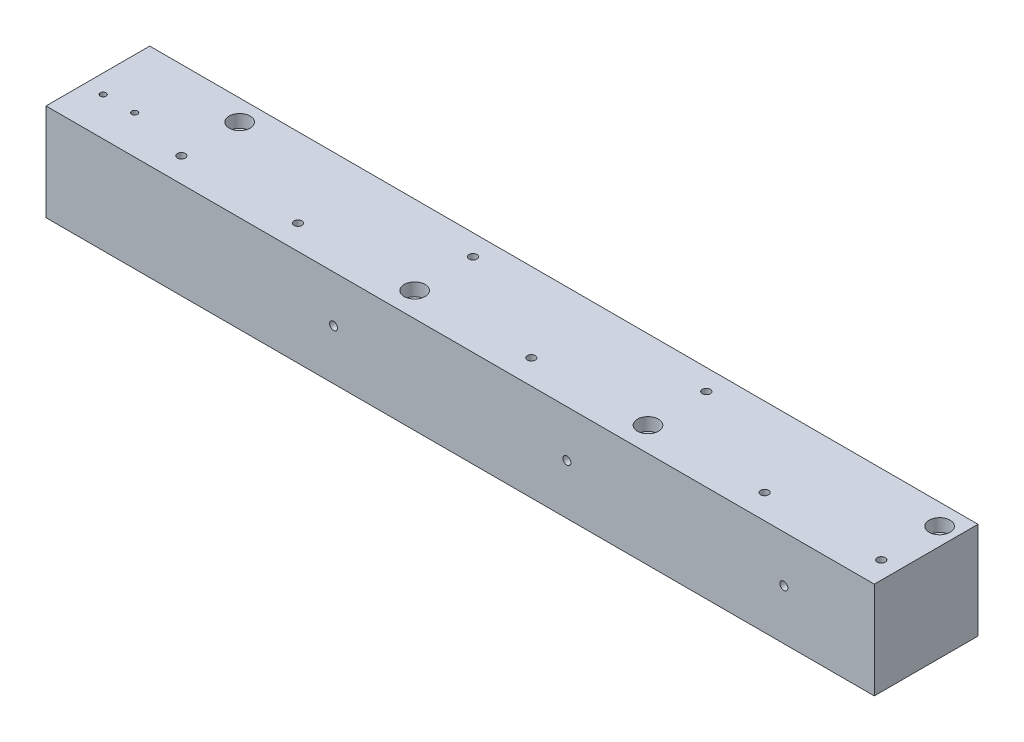
ISO-10303-21;
HEADER;
FILE_DESCRIPTION(('STEP AP214'),'2;1');
FILE_NAME('part.step','',(''),(''),'','','');
FILE_SCHEMA(('AUTOMOTIVE_DESIGN { 1 0 10303 214 1 1 1 1 }'));
ENDSEC;
DATA;
#1=APPLICATION_CONTEXT('core data for automotive mechanical design processes');
#2=APPLICATION_PROTOCOL_DEFINITION('international standard','automotive_design',2000,#1);
#3=PRODUCT_CONTEXT('',#1,'mechanical');
#4=PRODUCT('Part','Part','',(#3));
#5=PRODUCT_RELATED_PRODUCT_CATEGORY('part','',(#4));
#6=PRODUCT_DEFINITION_FORMATION('','',#4);
#7=PRODUCT_DEFINITION_CONTEXT('part definition',#1,'design');
#8=PRODUCT_DEFINITION('design','',#6,#7);
#9=PRODUCT_DEFINITION_SHAPE('','',#8);
#10=(LENGTH_UNIT() NAMED_UNIT(*) SI_UNIT(.MILLI.,.METRE.));
#11=(NAMED_UNIT(*) PLANE_ANGLE_UNIT() SI_UNIT($,.RADIAN.));
#12=(NAMED_UNIT(*) SI_UNIT($,.STERADIAN.) SOLID_ANGLE_UNIT());
#13=UNCERTAINTY_MEASURE_WITH_UNIT(LENGTH_MEASURE(1.E-05),#10,'distance_accuracy_value','');
#14=(GEOMETRIC_REPRESENTATION_CONTEXT(3) GLOBAL_UNCERTAINTY_ASSIGNED_CONTEXT((#13)) GLOBAL_UNIT_ASSIGNED_CONTEXT((#10,
#11,#12)) REPRESENTATION_CONTEXT('',''));
#15=CARTESIAN_POINT('',(0.,0.,0.));
#16=DIRECTION('',(0.,0.,1.));
#17=DIRECTION('',(1.,0.,0.));
#18=AXIS2_PLACEMENT_3D('',#15,#16,#17);
#19=CARTESIAN_POINT('',(0.,0.,88.9));
#20=DIRECTION('',(1.,0.,0.));
#21=DIRECTION('',(0.,0.,-1.));
#22=AXIS2_PLACEMENT_3D('',#19,#20,#21);
#23=PLANE('',#22);
#24=DIRECTION('',(0.,-1.,0.));
#25=VECTOR('',#24,1.);
#26=CARTESIAN_POINT('',(0.,0.,0.));
#27=LINE('',#26,#25);
#28=CARTESIAN_POINT('',(0.,83.,0.));
#29=VERTEX_POINT('',#28);
#30=CARTESIAN_POINT('',(0.,0.,0.));
#31=VERTEX_POINT('',#30);
#32=EDGE_CURVE('E253',#29,#31,#27,.T.);
#33=ORIENTED_EDGE('',*,*,#32,.T.);
#34=DIRECTION('',(0.,0.,-1.));
#35=VECTOR('',#34,1.);
#36=CARTESIAN_POINT('',(0.,0.,88.9));
#37=LINE('',#36,#35);
#38=CARTESIAN_POINT('',(0.,0.,88.9));
#39=VERTEX_POINT('',#38);
#40=EDGE_CURVE('E11',#39,#31,#37,.T.);
#41=ORIENTED_EDGE('',*,*,#40,.F.);
#42=DIRECTION('',(0.,-1.,0.));
#43=VECTOR('',#42,1.);
#44=CARTESIAN_POINT('',(0.,0.,88.9));
#45=LINE('',#44,#43);
#46=CARTESIAN_POINT('',(0.,83.,88.9));
#47=VERTEX_POINT('',#46);
#48=EDGE_CURVE('E254',#47,#39,#45,.T.);
#49=ORIENTED_EDGE('',*,*,#48,.F.);
#50=DIRECTION('',(0.,0.,-1.));
#51=VECTOR('',#50,1.);
#52=CARTESIAN_POINT('',(0.,83.,88.9));
#53=LINE('',#52,#51);
#54=EDGE_CURVE('E260',#47,#29,#53,.T.);
#55=ORIENTED_EDGE('',*,*,#54,.T.);
#56=EDGE_LOOP('',(#33,#41,#49,#55));
#57=FACE_BOUND('',#56,.T.);
#58=ADVANCED_FACE('F40',(#57),#23,.F.);
#59=CARTESIAN_POINT('',(0.,0.,88.9));
#60=DIRECTION('',(0.,1.,0.));
#61=DIRECTION('',(0.,0.,1.));
#62=AXIS2_PLACEMENT_3D('',#59,#60,#61);
#63=PLANE('',#62);
#64=CARTESIAN_POINT('',(695.,0.,17.9));
#65=DIRECTION('',(0.,1.,0.));
#66=DIRECTION('',(0.,0.,1.));
#67=AXIS2_PLACEMENT_3D('',#64,#65,#66);
#68=CIRCLE('',#67,5.49999999999995);
#69=CARTESIAN_POINT('',(695.,0.,23.3999999999999));
#70=VERTEX_POINT('',#69);
#71=EDGE_CURVE('E172',#70,#70,#68,.T.);
#72=ORIENTED_EDGE('',*,*,#71,.T.);
#73=EDGE_LOOP('',(#72));
#74=FACE_BOUND('',#73,.T.);
#75=CARTESIAN_POINT('',(495.,0.,67.9));
#76=DIRECTION('',(0.,1.,0.));
#77=DIRECTION('',(0.,0.,1.));
#78=AXIS2_PLACEMENT_3D('',#75,#76,#77);
#79=CIRCLE('',#78,5.49999999999995);
#80=CARTESIAN_POINT('',(495.,0.,73.3999999999999));
#81=VERTEX_POINT('',#80);
#82=EDGE_CURVE('E184',#81,#81,#79,.T.);
#83=ORIENTED_EDGE('',*,*,#82,.T.);
#84=EDGE_LOOP('',(#83));
#85=FACE_BOUND('',#84,.T.);
#86=CARTESIAN_POINT('',(295.,0.,67.9));
#87=DIRECTION('',(0.,1.,0.));
#88=DIRECTION('',(0.,0.,1.));
#89=AXIS2_PLACEMENT_3D('',#86,#87,#88);
#90=CIRCLE('',#89,5.50000000000001);
#91=CARTESIAN_POINT('',(295.,0.,73.4));
#92=VERTEX_POINT('',#91);
#93=EDGE_CURVE('E196',#92,#92,#90,.T.);
#94=ORIENTED_EDGE('',*,*,#93,.T.);
#95=EDGE_LOOP('',(#94));
#96=FACE_BOUND('',#95,.T.);
#97=CARTESIAN_POINT('',(95.,0.,17.9));
#98=DIRECTION('',(0.,1.,0.));
#99=DIRECTION('',(0.,0.,1.));
#100=AXIS2_PLACEMENT_3D('',#97,#98,#99);
#101=CIRCLE('',#100,5.49999999999998);
#102=CARTESIAN_POINT('',(95.,0.,23.3999999999999));
#103=VERTEX_POINT('',#102);
#104=EDGE_CURVE('E208',#103,#103,#101,.T.);
#105=ORIENTED_EDGE('',*,*,#104,.T.);
#106=EDGE_LOOP('',(#105));
#107=FACE_BOUND('',#106,.T.);
#108=DIRECTION('',(1.,0.,0.));
#109=VECTOR('',#108,1.);
#110=CARTESIAN_POINT('',(0.,0.,0.));
#111=LINE('',#110,#109);
#112=CARTESIAN_POINT('',(710.,0.,0.));
#113=VERTEX_POINT('',#112);
#114=EDGE_CURVE('E263',#31,#113,#111,.T.);
#115=ORIENTED_EDGE('',*,*,#114,.T.);
#116=DIRECTION('',(0.,0.,-1.));
#117=VECTOR('',#116,1.);
#118=CARTESIAN_POINT('',(710.,0.,88.9));
#119=LINE('',#118,#117);
#120=CARTESIAN_POINT('',(710.,0.,88.9));
#121=VERTEX_POINT('',#120);
#122=EDGE_CURVE('E48',#121,#113,#119,.T.);
#123=ORIENTED_EDGE('',*,*,#122,.F.);
#124=DIRECTION('',(1.,0.,0.));
#125=VECTOR('',#124,1.);
#126=CARTESIAN_POINT('',(0.,0.,88.9));
#127=LINE('',#126,#125);
#128=EDGE_CURVE('E87',#39,#121,#127,.T.);
#129=ORIENTED_EDGE('',*,*,#128,.F.);
#130=ORIENTED_EDGE('',*,*,#40,.T.);
#131=EDGE_LOOP('',(#115,#123,#129,#130));
#132=FACE_BOUND('',#131,.T.);
#133=ADVANCED_FACE('F288',(#74,#85,#96,#107,#132),#63,.F.);
#134=CARTESIAN_POINT('',(710.,0.,88.9));
#135=DIRECTION('',(-1.,0.,0.));
#136=DIRECTION('',(0.,0.,1.));
#137=AXIS2_PLACEMENT_3D('',#134,#135,#136);
#138=PLANE('',#137);
#139=DIRECTION('',(0.,1.,0.));
#140=VECTOR('',#139,1.);
#141=CARTESIAN_POINT('',(710.,0.,0.));
#142=LINE('',#141,#140);
#143=CARTESIAN_POINT('',(710.,83.,0.));
#144=VERTEX_POINT('',#143);
#145=EDGE_CURVE('E74',#113,#144,#142,.T.);
#146=ORIENTED_EDGE('',*,*,#145,.T.);
#147=DIRECTION('',(0.,0.,-1.));
#148=VECTOR('',#147,1.);
#149=CARTESIAN_POINT('',(710.,83.,88.9));
#150=LINE('',#149,#148);
#151=CARTESIAN_POINT('',(710.,83.,88.9));
#152=VERTEX_POINT('',#151);
#153=EDGE_CURVE('E268',#152,#144,#150,.T.);
#154=ORIENTED_EDGE('',*,*,#153,.F.);
#155=DIRECTION('',(0.,1.,0.));
#156=VECTOR('',#155,1.);
#157=CARTESIAN_POINT('',(710.,0.,88.9));
#158=LINE('',#157,#156);
#159=EDGE_CURVE('E257',#121,#152,#158,.T.);
#160=ORIENTED_EDGE('',*,*,#159,.F.);
#161=ORIENTED_EDGE('',*,*,#122,.T.);
#162=EDGE_LOOP('',(#146,#154,#160,#161));
#163=FACE_BOUND('',#162,.T.);
#164=ADVANCED_FACE('F270',(#163),#138,.F.);
#165=CARTESIAN_POINT('',(0.,83.,88.9));
#166=DIRECTION('',(0.,-1.,0.));
#167=DIRECTION('',(0.,0.,-1.));
#168=AXIS2_PLACEMENT_3D('',#165,#166,#167);
#169=PLANE('',#168);
#170=CARTESIAN_POINT('',(16.,83.,55.9));
#171=DIRECTION('',(0.,1.,0.));
#172=DIRECTION('',(0.,0.,1.));
#173=AXIS2_PLACEMENT_3D('',#170,#171,#172);
#174=CIRCLE('',#173,2.5);
#175=CARTESIAN_POINT('',(16.,83.,58.4));
#176=VERTEX_POINT('',#175);
#177=EDGE_CURVE('E151',#176,#176,#174,.T.);
#178=ORIENTED_EDGE('',*,*,#177,.F.);
#179=EDGE_LOOP('',(#178));
#180=FACE_BOUND('',#179,.T.);
#181=CARTESIAN_POINT('',(43.,83.,55.9));
#182=DIRECTION('',(0.,1.,0.));
#183=DIRECTION('',(0.,0.,1.));
#184=AXIS2_PLACEMENT_3D('',#181,#182,#183);
#185=CIRCLE('',#184,2.5);
#186=CARTESIAN_POINT('',(43.,83.,58.4));
#187=VERTEX_POINT('',#186);
#188=EDGE_CURVE('E157',#187,#187,#185,.T.);
#189=ORIENTED_EDGE('',*,*,#188,.F.);
#190=EDGE_LOOP('',(#189));
#191=FACE_BOUND('',#190,.T.);
#192=CARTESIAN_POINT('',(695.,83.,17.9));
#193=DIRECTION('',(0.,1.,0.));
#194=DIRECTION('',(0.,0.,1.));
#195=AXIS2_PLACEMENT_3D('',#192,#193,#194);
#196=CIRCLE('',#195,9.00000000000001);
#197=CARTESIAN_POINT('',(695.,83.,26.9));
#198=VERTEX_POINT('',#197);
#199=EDGE_CURVE('E163',#198,#198,#196,.T.);
#200=ORIENTED_EDGE('',*,*,#199,.F.);
#201=EDGE_LOOP('',(#200));
#202=FACE_BOUND('',#201,.T.);
#203=CARTESIAN_POINT('',(495.,83.,67.9));
#204=DIRECTION('',(0.,1.,0.));
#205=DIRECTION('',(0.,0.,1.));
#206=AXIS2_PLACEMENT_3D('',#203,#204,#205);
#207=CIRCLE('',#206,9.00000000000001);
#208=CARTESIAN_POINT('',(495.,83.,76.9));
#209=VERTEX_POINT('',#208);
#210=EDGE_CURVE('E175',#209,#209,#207,.T.);
#211=ORIENTED_EDGE('',*,*,#210,.F.);
#212=EDGE_LOOP('',(#211));
#213=FACE_BOUND('',#212,.T.);
#214=CARTESIAN_POINT('',(295.,83.,67.9));
#215=DIRECTION('',(0.,1.,0.));
#216=DIRECTION('',(0.,0.,1.));
#217=AXIS2_PLACEMENT_3D('',#214,#215,#216);
#218=CIRCLE('',#217,9.00000000000001);
#219=CARTESIAN_POINT('',(295.,83.,76.9));
#220=VERTEX_POINT('',#219);
#221=EDGE_CURVE('E187',#220,#220,#218,.T.);
#222=ORIENTED_EDGE('',*,*,#221,.F.);
#223=EDGE_LOOP('',(#222));
#224=FACE_BOUND('',#223,.T.);
#225=CARTESIAN_POINT('',(95.,83.,17.9));
#226=DIRECTION('',(0.,1.,0.));
#227=DIRECTION('',(0.,0.,1.));
#228=AXIS2_PLACEMENT_3D('',#225,#226,#227);
#229=CIRCLE('',#228,9.00000000000001);
#230=CARTESIAN_POINT('',(95.,83.,26.9));
#231=VERTEX_POINT('',#230);
#232=EDGE_CURVE('E199',#231,#231,#229,.T.);
#233=ORIENTED_EDGE('',*,*,#232,.F.);
#234=EDGE_LOOP('',(#233));
#235=FACE_BOUND('',#234,.T.);
#236=CARTESIAN_POINT('',(95.,83.,67.9));
#237=DIRECTION('',(0.,1.,0.));
#238=DIRECTION('',(0.,0.,1.));
#239=AXIS2_PLACEMENT_3D('',#236,#237,#238);
#240=CIRCLE('',#239,3.4);
#241=CARTESIAN_POINT('',(95.,83.,71.3));
#242=VERTEX_POINT('',#241);
#243=EDGE_CURVE('E211',#242,#242,#240,.T.);
#244=ORIENTED_EDGE('',*,*,#243,.F.);
#245=EDGE_LOOP('',(#244));
#246=FACE_BOUND('',#245,.T.);
#247=CARTESIAN_POINT('',(195.,83.,67.9));
#248=DIRECTION('',(0.,1.,0.));
#249=DIRECTION('',(0.,0.,1.));
#250=AXIS2_PLACEMENT_3D('',#247,#248,#249);
#251=CIRCLE('',#250,3.39999999999999);
#252=CARTESIAN_POINT('',(195.,83.,71.3));
#253=VERTEX_POINT('',#252);
#254=EDGE_CURVE('E217',#253,#253,#251,.T.);
#255=ORIENTED_EDGE('',*,*,#254,.F.);
#256=EDGE_LOOP('',(#255));
#257=FACE_BOUND('',#256,.T.);
#258=CARTESIAN_POINT('',(295.,83.,17.9));
#259=DIRECTION('',(0.,1.,0.));
#260=DIRECTION('',(0.,0.,1.));
#261=AXIS2_PLACEMENT_3D('',#258,#259,#260);
#262=CIRCLE('',#261,3.40000000000001);
#263=CARTESIAN_POINT('',(295.,83.,21.3));
#264=VERTEX_POINT('',#263);
#265=EDGE_CURVE('E223',#264,#264,#262,.T.);
#266=ORIENTED_EDGE('',*,*,#265,.F.);
#267=EDGE_LOOP('',(#266));
#268=FACE_BOUND('',#267,.T.);
#269=CARTESIAN_POINT('',(395.,83.,67.9));
#270=DIRECTION('',(0.,1.,0.));
#271=DIRECTION('',(0.,0.,1.));
#272=AXIS2_PLACEMENT_3D('',#269,#270,#271);
#273=CIRCLE('',#272,3.40000000000001);
#274=CARTESIAN_POINT('',(395.,83.,71.3));
#275=VERTEX_POINT('',#274);
#276=EDGE_CURVE('E229',#275,#275,#273,.T.);
#277=ORIENTED_EDGE('',*,*,#276,.F.);
#278=EDGE_LOOP('',(#277));
#279=FACE_BOUND('',#278,.T.);
#280=CARTESIAN_POINT('',(495.,83.,17.9));
#281=DIRECTION('',(0.,1.,0.));
#282=DIRECTION('',(0.,0.,1.));
#283=AXIS2_PLACEMENT_3D('',#280,#281,#282);
#284=CIRCLE('',#283,3.40000000000001);
#285=CARTESIAN_POINT('',(495.,83.,21.3));
#286=VERTEX_POINT('',#285);
#287=EDGE_CURVE('E235',#286,#286,#284,.T.);
#288=ORIENTED_EDGE('',*,*,#287,.F.);
#289=EDGE_LOOP('',(#288));
#290=FACE_BOUND('',#289,.T.);
#291=CARTESIAN_POINT('',(595.,83.,67.8999999999999));
#292=DIRECTION('',(0.,1.,0.));
#293=DIRECTION('',(0.,0.,1.));
#294=AXIS2_PLACEMENT_3D('',#291,#292,#293);
#295=CIRCLE('',#294,3.39999999999996);
#296=CARTESIAN_POINT('',(595.,83.,71.2999999999999));
#297=VERTEX_POINT('',#296);
#298=EDGE_CURVE('E241',#297,#297,#295,.T.);
#299=ORIENTED_EDGE('',*,*,#298,.F.);
#300=EDGE_LOOP('',(#299));
#301=FACE_BOUND('',#300,.T.);
#302=CARTESIAN_POINT('',(695.,83.,67.9));
#303=DIRECTION('',(0.,1.,0.));
#304=DIRECTION('',(0.,0.,1.));
#305=AXIS2_PLACEMENT_3D('',#302,#303,#304);
#306=CIRCLE('',#305,3.39999999999996);
#307=CARTESIAN_POINT('',(695.,83.,71.2999999999999));
#308=VERTEX_POINT('',#307);
#309=EDGE_CURVE('E247',#308,#308,#306,.T.);
#310=ORIENTED_EDGE('',*,*,#309,.F.);
#311=EDGE_LOOP('',(#310));
#312=FACE_BOUND('',#311,.T.);
#313=DIRECTION('',(-1.,0.,0.));
#314=VECTOR('',#313,1.);
#315=CARTESIAN_POINT('',(0.,83.,0.));
#316=LINE('',#315,#314);
#317=EDGE_CURVE('E80',#144,#29,#316,.T.);
#318=ORIENTED_EDGE('',*,*,#317,.T.);
#319=ORIENTED_EDGE('',*,*,#54,.F.);
#320=DIRECTION('',(-1.,0.,0.));
#321=VECTOR('',#320,1.);
#322=CARTESIAN_POINT('',(0.,83.,88.9));
#323=LINE('',#322,#321);
#324=EDGE_CURVE('E56',#152,#47,#323,.T.);
#325=ORIENTED_EDGE('',*,*,#324,.F.);
#326=ORIENTED_EDGE('',*,*,#153,.T.);
#327=EDGE_LOOP('',(#318,#319,#325,#326));
#328=FACE_BOUND('',#327,.T.);
#329=ADVANCED_FACE('F277',(#180,#191,#202,#213,#224,#235,#246,#257,#268,#279,#290,#301,#312,
#328),#169,.F.);
#330=CARTESIAN_POINT('',(0.,0.,88.9));
#331=DIRECTION('',(0.,0.,-1.));
#332=DIRECTION('',(-1.,0.,0.));
#333=AXIS2_PLACEMENT_3D('',#330,#331,#332);
#334=PLANE('',#333);
#335=CARTESIAN_POINT('',(246.5,43.,88.9));
#336=DIRECTION('',(0.,0.,1.));
#337=DIRECTION('',(1.,0.,0.));
#338=AXIS2_PLACEMENT_3D('',#335,#336,#337);
#339=CIRCLE('',#338,3.39999999999999);
#340=CARTESIAN_POINT('',(249.9,43.,88.9));
#341=VERTEX_POINT('',#340);
#342=EDGE_CURVE('E135',#341,#341,#339,.T.);
#343=ORIENTED_EDGE('',*,*,#342,.F.);
#344=EDGE_LOOP('',(#343));
#345=FACE_BOUND('',#344,.T.);
#346=CARTESIAN_POINT('',(446.5,43.,88.9));
#347=DIRECTION('',(0.,0.,1.));
#348=DIRECTION('',(1.,0.,0.));
#349=AXIS2_PLACEMENT_3D('',#346,#347,#348);
#350=CIRCLE('',#349,3.40000000000001);
#351=CARTESIAN_POINT('',(449.9,43.,88.9));
#352=VERTEX_POINT('',#351);
#353=EDGE_CURVE('E134',#352,#352,#350,.T.);
#354=ORIENTED_EDGE('',*,*,#353,.F.);
#355=EDGE_LOOP('',(#354));
#356=FACE_BOUND('',#355,.T.);
#357=CARTESIAN_POINT('',(632.5,43.,88.9));
#358=DIRECTION('',(0.,0.,1.));
#359=DIRECTION('',(1.,0.,0.));
#360=AXIS2_PLACEMENT_3D('',#357,#358,#359);
#361=CIRCLE('',#360,3.39999999999996);
#362=CARTESIAN_POINT('',(635.9,43.,88.9));
#363=VERTEX_POINT('',#362);
#364=EDGE_CURVE('E145',#363,#363,#361,.T.);
#365=ORIENTED_EDGE('',*,*,#364,.F.);
#366=EDGE_LOOP('',(#365));
#367=FACE_BOUND('',#366,.T.);
#368=ORIENTED_EDGE('',*,*,#48,.T.);
#369=ORIENTED_EDGE('',*,*,#128,.T.);
#370=ORIENTED_EDGE('',*,*,#159,.T.);
#371=ORIENTED_EDGE('',*,*,#324,.T.);
#372=EDGE_LOOP('',(#368,#369,#370,#371));
#373=FACE_BOUND('',#372,.T.);
#374=ADVANCED_FACE('F279',(#345,#356,#367,#373),#334,.F.);
#375=CARTESIAN_POINT('',(0.,0.,0.));
#376=DIRECTION('',(0.,0.,-1.));
#377=DIRECTION('',(-1.,0.,0.));
#378=AXIS2_PLACEMENT_3D('',#375,#376,#377);
#379=PLANE('',#378);
#380=ORIENTED_EDGE('',*,*,#32,.F.);
#381=ORIENTED_EDGE('',*,*,#317,.F.);
#382=ORIENTED_EDGE('',*,*,#145,.F.);
#383=ORIENTED_EDGE('',*,*,#114,.F.);
#384=EDGE_LOOP('',(#380,#381,#382,#383));
#385=FACE_BOUND('',#384,.T.);
#386=ADVANCED_FACE('F273',(#385),#379,.T.);
#387=CARTESIAN_POINT('',(695.,50.01,67.9));
#388=DIRECTION('',(0.,1.,0.));
#389=DIRECTION('',(0.,0.,1.));
#390=AXIS2_PLACEMENT_3D('',#387,#388,#389);
#391=CONICAL_SURFACE('',#390,3.39999999999996,1.02974425867665);
#392=CARTESIAN_POINT('',(695.,47.9670738953063,67.9));
#393=VERTEX_POINT('',#392);
#394=VERTEX_LOOP('',#393);
#395=FACE_BOUND('',#394,.T.);
#396=CARTESIAN_POINT('',(695.,50.01,67.9));
#397=DIRECTION('',(0.,1.,0.));
#398=DIRECTION('',(0.,0.,1.));
#399=AXIS2_PLACEMENT_3D('',#396,#397,#398);
#400=CIRCLE('',#399,3.39999999999996);
#401=CARTESIAN_POINT('',(695.,50.01,71.2999999999999));
#402=VERTEX_POINT('',#401);
#403=EDGE_CURVE('E250',#402,#402,#400,.T.);
#404=ORIENTED_EDGE('',*,*,#403,.T.);
#405=EDGE_LOOP('',(#404));
#406=FACE_BOUND('',#405,.T.);
#407=ADVANCED_FACE('F346',(#395,#406),#391,.F.);
#408=CARTESIAN_POINT('',(695.,83.,67.9));
#409=DIRECTION('',(0.,1.,0.));
#410=DIRECTION('',(0.,0.,1.));
#411=AXIS2_PLACEMENT_3D('',#408,#409,#410);
#412=CYLINDRICAL_SURFACE('',#411,3.39999999999996);
#413=ORIENTED_EDGE('',*,*,#403,.F.);
#414=EDGE_LOOP('',(#413));
#415=FACE_BOUND('',#414,.T.);
#416=ORIENTED_EDGE('',*,*,#309,.T.);
#417=EDGE_LOOP('',(#416));
#418=FACE_BOUND('',#417,.T.);
#419=ADVANCED_FACE('F343',(#415,#418),#412,.F.);
#420=CARTESIAN_POINT('',(595.,50.01,67.8999999999999));
#421=DIRECTION('',(0.,1.,0.));
#422=DIRECTION('',(0.,0.,1.));
#423=AXIS2_PLACEMENT_3D('',#420,#421,#422);
#424=CONICAL_SURFACE('',#423,3.39999999999996,1.02974425867665);
#425=CARTESIAN_POINT('',(595.,47.9670738953063,67.8999999999999));
#426=VERTEX_POINT('',#425);
#427=VERTEX_LOOP('',#426);
#428=FACE_BOUND('',#427,.T.);
#429=CARTESIAN_POINT('',(595.,50.01,67.8999999999999));
#430=DIRECTION('',(0.,1.,0.));
#431=DIRECTION('',(0.,0.,1.));
#432=AXIS2_PLACEMENT_3D('',#429,#430,#431);
#433=CIRCLE('',#432,3.39999999999996);
#434=CARTESIAN_POINT('',(595.,50.01,71.2999999999999));
#435=VERTEX_POINT('',#434);
#436=EDGE_CURVE('E244',#435,#435,#433,.T.);
#437=ORIENTED_EDGE('',*,*,#436,.T.);
#438=EDGE_LOOP('',(#437));
#439=FACE_BOUND('',#438,.T.);
#440=ADVANCED_FACE('F345',(#428,#439),#424,.F.);
#441=CARTESIAN_POINT('',(595.,83.,67.8999999999999));
#442=DIRECTION('',(0.,1.,0.));
#443=DIRECTION('',(0.,0.,1.));
#444=AXIS2_PLACEMENT_3D('',#441,#442,#443);
#445=CYLINDRICAL_SURFACE('',#444,3.39999999999996);
#446=ORIENTED_EDGE('',*,*,#436,.F.);
#447=EDGE_LOOP('',(#446));
#448=FACE_BOUND('',#447,.T.);
#449=ORIENTED_EDGE('',*,*,#298,.T.);
#450=EDGE_LOOP('',(#449));
#451=FACE_BOUND('',#450,.T.);
#452=ADVANCED_FACE('F353',(#448,#451),#445,.F.);
#453=CARTESIAN_POINT('',(495.,50.01,17.9));
#454=DIRECTION('',(0.,1.,0.));
#455=DIRECTION('',(0.,0.,1.));
#456=AXIS2_PLACEMENT_3D('',#453,#454,#455);
#457=CONICAL_SURFACE('',#456,3.40000000000001,1.02974425867666);
#458=CARTESIAN_POINT('',(495.,47.9670738953063,17.9));
#459=VERTEX_POINT('',#458);
#460=VERTEX_LOOP('',#459);
#461=FACE_BOUND('',#460,.T.);
#462=CARTESIAN_POINT('',(495.,50.01,17.9));
#463=DIRECTION('',(0.,1.,0.));
#464=DIRECTION('',(0.,0.,1.));
#465=AXIS2_PLACEMENT_3D('',#462,#463,#464);
#466=CIRCLE('',#465,3.40000000000001);
#467=CARTESIAN_POINT('',(495.,50.01,21.3));
#468=VERTEX_POINT('',#467);
#469=EDGE_CURVE('E238',#468,#468,#466,.T.);
#470=ORIENTED_EDGE('',*,*,#469,.T.);
#471=EDGE_LOOP('',(#470));
#472=FACE_BOUND('',#471,.T.);
#473=ADVANCED_FACE('F393',(#461,#472),#457,.F.);
#474=CARTESIAN_POINT('',(495.,83.,17.9));
#475=DIRECTION('',(0.,1.,0.));
#476=DIRECTION('',(0.,0.,1.));
#477=AXIS2_PLACEMENT_3D('',#474,#475,#476);
#478=CYLINDRICAL_SURFACE('',#477,3.40000000000001);
#479=ORIENTED_EDGE('',*,*,#469,.F.);
#480=EDGE_LOOP('',(#479));
#481=FACE_BOUND('',#480,.T.);
#482=ORIENTED_EDGE('',*,*,#287,.T.);
#483=EDGE_LOOP('',(#482));
#484=FACE_BOUND('',#483,.T.);
#485=ADVANCED_FACE('F404',(#481,#484),#478,.F.);
#486=CARTESIAN_POINT('',(395.,50.01,67.9));
#487=DIRECTION('',(0.,1.,0.));
#488=DIRECTION('',(0.,0.,1.));
#489=AXIS2_PLACEMENT_3D('',#486,#487,#488);
#490=CONICAL_SURFACE('',#489,3.40000000000001,1.02974425867666);
#491=CARTESIAN_POINT('',(395.,47.9670738953063,67.9));
#492=VERTEX_POINT('',#491);
#493=VERTEX_LOOP('',#492);
#494=FACE_BOUND('',#493,.T.);
#495=CARTESIAN_POINT('',(395.,50.01,67.9));
#496=DIRECTION('',(0.,1.,0.));
#497=DIRECTION('',(0.,0.,1.));
#498=AXIS2_PLACEMENT_3D('',#495,#496,#497);
#499=CIRCLE('',#498,3.40000000000001);
#500=CARTESIAN_POINT('',(395.,50.01,71.3));
#501=VERTEX_POINT('',#500);
#502=EDGE_CURVE('E232',#501,#501,#499,.T.);
#503=ORIENTED_EDGE('',*,*,#502,.T.);
#504=EDGE_LOOP('',(#503));
#505=FACE_BOUND('',#504,.T.);
#506=ADVANCED_FACE('F414',(#494,#505),#490,.F.);
#507=CARTESIAN_POINT('',(395.,83.,67.9));
#508=DIRECTION('',(0.,1.,0.));
#509=DIRECTION('',(0.,0.,1.));
#510=AXIS2_PLACEMENT_3D('',#507,#508,#509);
#511=CYLINDRICAL_SURFACE('',#510,3.40000000000001);
#512=ORIENTED_EDGE('',*,*,#502,.F.);
#513=EDGE_LOOP('',(#512));
#514=FACE_BOUND('',#513,.T.);
#515=ORIENTED_EDGE('',*,*,#276,.T.);
#516=EDGE_LOOP('',(#515));
#517=FACE_BOUND('',#516,.T.);
#518=ADVANCED_FACE('F426',(#514,#517),#511,.F.);
#519=CARTESIAN_POINT('',(295.,50.01,17.9));
#520=DIRECTION('',(0.,1.,0.));
#521=DIRECTION('',(0.,0.,1.));
#522=AXIS2_PLACEMENT_3D('',#519,#520,#521);
#523=CONICAL_SURFACE('',#522,3.40000000000001,1.02974425867666);
#524=CARTESIAN_POINT('',(295.,47.9670738953063,17.9));
#525=VERTEX_POINT('',#524);
#526=VERTEX_LOOP('',#525);
#527=FACE_BOUND('',#526,.T.);
#528=CARTESIAN_POINT('',(295.,50.01,17.9));
#529=DIRECTION('',(0.,1.,0.));
#530=DIRECTION('',(0.,0.,1.));
#531=AXIS2_PLACEMENT_3D('',#528,#529,#530);
#532=CIRCLE('',#531,3.40000000000001);
#533=CARTESIAN_POINT('',(295.,50.01,21.3));
#534=VERTEX_POINT('',#533);
#535=EDGE_CURVE('E226',#534,#534,#532,.T.);
#536=ORIENTED_EDGE('',*,*,#535,.T.);
#537=EDGE_LOOP('',(#536));
#538=FACE_BOUND('',#537,.T.);
#539=ADVANCED_FACE('F436',(#527,#538),#523,.F.);
#540=CARTESIAN_POINT('',(295.,83.,17.9));
#541=DIRECTION('',(0.,1.,0.));
#542=DIRECTION('',(0.,0.,1.));
#543=AXIS2_PLACEMENT_3D('',#540,#541,#542);
#544=CYLINDRICAL_SURFACE('',#543,3.40000000000001);
#545=ORIENTED_EDGE('',*,*,#535,.F.);
#546=EDGE_LOOP('',(#545));
#547=FACE_BOUND('',#546,.T.);
#548=ORIENTED_EDGE('',*,*,#265,.T.);
#549=EDGE_LOOP('',(#548));
#550=FACE_BOUND('',#549,.T.);
#551=ADVANCED_FACE('F448',(#547,#550),#544,.F.);
#552=CARTESIAN_POINT('',(195.,50.01,67.9));
#553=DIRECTION('',(0.,1.,0.));
#554=DIRECTION('',(0.,0.,1.));
#555=AXIS2_PLACEMENT_3D('',#552,#553,#554);
#556=CONICAL_SURFACE('',#555,3.39999999999999,1.02974425867665);
#557=CARTESIAN_POINT('',(195.,47.9670738953063,67.9));
#558=VERTEX_POINT('',#557);
#559=VERTEX_LOOP('',#558);
#560=FACE_BOUND('',#559,.T.);
#561=CARTESIAN_POINT('',(195.,50.01,67.9));
#562=DIRECTION('',(0.,1.,0.));
#563=DIRECTION('',(0.,0.,1.));
#564=AXIS2_PLACEMENT_3D('',#561,#562,#563);
#565=CIRCLE('',#564,3.39999999999999);
#566=CARTESIAN_POINT('',(195.,50.01,71.3));
#567=VERTEX_POINT('',#566);
#568=EDGE_CURVE('E220',#567,#567,#565,.T.);
#569=ORIENTED_EDGE('',*,*,#568,.T.);
#570=EDGE_LOOP('',(#569));
#571=FACE_BOUND('',#570,.T.);
#572=ADVANCED_FACE('F458',(#560,#571),#556,.F.);
#573=CARTESIAN_POINT('',(195.,83.,67.9));
#574=DIRECTION('',(0.,1.,0.));
#575=DIRECTION('',(0.,0.,1.));
#576=AXIS2_PLACEMENT_3D('',#573,#574,#575);
#577=CYLINDRICAL_SURFACE('',#576,3.39999999999999);
#578=ORIENTED_EDGE('',*,*,#568,.F.);
#579=EDGE_LOOP('',(#578));
#580=FACE_BOUND('',#579,.T.);
#581=ORIENTED_EDGE('',*,*,#254,.T.);
#582=EDGE_LOOP('',(#581));
#583=FACE_BOUND('',#582,.T.);
#584=ADVANCED_FACE('F470',(#580,#583),#577,.F.);
#585=CARTESIAN_POINT('',(95.,50.01,67.9));
#586=DIRECTION('',(0.,1.,0.));
#587=DIRECTION('',(0.,0.,1.));
#588=AXIS2_PLACEMENT_3D('',#585,#586,#587);
#589=CONICAL_SURFACE('',#588,3.39999999999999,1.02974425867665);
#590=CARTESIAN_POINT('',(95.,47.9670738953063,67.9));
#591=VERTEX_POINT('',#590);
#592=VERTEX_LOOP('',#591);
#593=FACE_BOUND('',#592,.T.);
#594=CARTESIAN_POINT('',(95.,50.01,67.9));
#595=DIRECTION('',(0.,1.,0.));
#596=DIRECTION('',(0.,0.,1.));
#597=AXIS2_PLACEMENT_3D('',#594,#595,#596);
#598=CIRCLE('',#597,3.39999999999999);
#599=CARTESIAN_POINT('',(95.,50.01,71.3));
#600=VERTEX_POINT('',#599);
#601=EDGE_CURVE('E214',#600,#600,#598,.T.);
#602=ORIENTED_EDGE('',*,*,#601,.T.);
#603=EDGE_LOOP('',(#602));
#604=FACE_BOUND('',#603,.T.);
#605=ADVANCED_FACE('F480',(#593,#604),#589,.F.);
#606=CARTESIAN_POINT('',(95.,83.,67.9));
#607=DIRECTION('',(0.,1.,0.));
#608=DIRECTION('',(0.,0.,1.));
#609=AXIS2_PLACEMENT_3D('',#606,#607,#608);
#610=CYLINDRICAL_SURFACE('',#609,3.39999999999999);
#611=ORIENTED_EDGE('',*,*,#601,.F.);
#612=EDGE_LOOP('',(#611));
#613=FACE_BOUND('',#612,.T.);
#614=ORIENTED_EDGE('',*,*,#243,.T.);
#615=EDGE_LOOP('',(#614));
#616=FACE_BOUND('',#615,.T.);
#617=ADVANCED_FACE('F312',(#613,#616),#610,.F.);
#618=CARTESIAN_POINT('',(95.,83.,17.9));
#619=DIRECTION('',(0.,1.,0.));
#620=DIRECTION('',(0.,0.,1.));
#621=AXIS2_PLACEMENT_3D('',#618,#619,#620);
#622=CYLINDRICAL_SURFACE('',#621,5.49999999999999);
#623=ORIENTED_EDGE('',*,*,#104,.F.);
#624=EDGE_LOOP('',(#623));
#625=FACE_BOUND('',#624,.T.);
#626=CARTESIAN_POINT('',(95.,72.,17.9));
#627=DIRECTION('',(0.,1.,0.));
#628=DIRECTION('',(0.,0.,1.));
#629=AXIS2_PLACEMENT_3D('',#626,#627,#628);
#630=CIRCLE('',#629,5.50000000000001);
#631=CARTESIAN_POINT('',(95.,72.,23.4));
#632=VERTEX_POINT('',#631);
#633=EDGE_CURVE('E205',#632,#632,#630,.T.);
#634=ORIENTED_EDGE('',*,*,#633,.T.);
#635=EDGE_LOOP('',(#634));
#636=FACE_BOUND('',#635,.T.);
#637=ADVANCED_FACE('F308',(#625,#636),#622,.F.);
#638=CARTESIAN_POINT('',(100.5,72.,17.9));
#639=DIRECTION('',(0.,-1.,0.));
#640=DIRECTION('',(0.,0.,-1.));
#641=AXIS2_PLACEMENT_3D('',#638,#639,#640);
#642=PLANE('',#641);
#643=ORIENTED_EDGE('',*,*,#633,.F.);
#644=EDGE_LOOP('',(#643));
#645=FACE_BOUND('',#644,.T.);
#646=CARTESIAN_POINT('',(95.,72.,17.9));
#647=DIRECTION('',(0.,1.,0.));
#648=DIRECTION('',(0.,0.,1.));
#649=AXIS2_PLACEMENT_3D('',#646,#647,#648);
#650=CIRCLE('',#649,9.00000000000001);
#651=CARTESIAN_POINT('',(95.,72.,26.9));
#652=VERTEX_POINT('',#651);
#653=EDGE_CURVE('E202',#652,#652,#650,.T.);
#654=ORIENTED_EDGE('',*,*,#653,.T.);
#655=EDGE_LOOP('',(#654));
#656=FACE_BOUND('',#655,.T.);
#657=ADVANCED_FACE('F311',(#645,#656),#642,.F.);
#658=CARTESIAN_POINT('',(95.,83.,17.9));
#659=DIRECTION('',(0.,1.,0.));
#660=DIRECTION('',(0.,0.,1.));
#661=AXIS2_PLACEMENT_3D('',#658,#659,#660);
#662=CYLINDRICAL_SURFACE('',#661,9.00000000000001);
#663=ORIENTED_EDGE('',*,*,#653,.F.);
#664=EDGE_LOOP('',(#663));
#665=FACE_BOUND('',#664,.T.);
#666=ORIENTED_EDGE('',*,*,#232,.T.);
#667=EDGE_LOOP('',(#666));
#668=FACE_BOUND('',#667,.T.);
#669=ADVANCED_FACE('F318',(#665,#668),#662,.F.);
#670=CARTESIAN_POINT('',(295.,83.,67.9));
#671=DIRECTION('',(0.,1.,0.));
#672=DIRECTION('',(0.,0.,1.));
#673=AXIS2_PLACEMENT_3D('',#670,#671,#672);
#674=CYLINDRICAL_SURFACE('',#673,5.50000000000001);
#675=ORIENTED_EDGE('',*,*,#93,.F.);
#676=EDGE_LOOP('',(#675));
#677=FACE_BOUND('',#676,.T.);
#678=CARTESIAN_POINT('',(295.,72.,67.9));
#679=DIRECTION('',(0.,1.,0.));
#680=DIRECTION('',(0.,0.,1.));
#681=AXIS2_PLACEMENT_3D('',#678,#679,#680);
#682=CIRCLE('',#681,5.50000000000001);
#683=CARTESIAN_POINT('',(295.,72.,73.4));
#684=VERTEX_POINT('',#683);
#685=EDGE_CURVE('E193',#684,#684,#682,.T.);
#686=ORIENTED_EDGE('',*,*,#685,.T.);
#687=EDGE_LOOP('',(#686));
#688=FACE_BOUND('',#687,.T.);
#689=ADVANCED_FACE('F324',(#677,#688),#674,.F.);
#690=CARTESIAN_POINT('',(300.5,72.,67.9));
#691=DIRECTION('',(0.,-1.,0.));
#692=DIRECTION('',(0.,0.,-1.));
#693=AXIS2_PLACEMENT_3D('',#690,#691,#692);
#694=PLANE('',#693);
#695=ORIENTED_EDGE('',*,*,#685,.F.);
#696=EDGE_LOOP('',(#695));
#697=FACE_BOUND('',#696,.T.);
#698=CARTESIAN_POINT('',(295.,72.,67.9));
#699=DIRECTION('',(0.,1.,0.));
#700=DIRECTION('',(0.,0.,1.));
#701=AXIS2_PLACEMENT_3D('',#698,#699,#700);
#702=CIRCLE('',#701,9.00000000000001);
#703=CARTESIAN_POINT('',(295.,72.,76.9));
#704=VERTEX_POINT('',#703);
#705=EDGE_CURVE('E190',#704,#704,#702,.T.);
#706=ORIENTED_EDGE('',*,*,#705,.T.);
#707=EDGE_LOOP('',(#706));
#708=FACE_BOUND('',#707,.T.);
#709=ADVANCED_FACE('F538',(#697,#708),#694,.F.);
#710=CARTESIAN_POINT('',(295.,83.,67.9));
#711=DIRECTION('',(0.,1.,0.));
#712=DIRECTION('',(0.,0.,1.));
#713=AXIS2_PLACEMENT_3D('',#710,#711,#712);
#714=CYLINDRICAL_SURFACE('',#713,9.00000000000001);
#715=ORIENTED_EDGE('',*,*,#705,.F.);
#716=EDGE_LOOP('',(#715));
#717=FACE_BOUND('',#716,.T.);
#718=ORIENTED_EDGE('',*,*,#221,.T.);
#719=EDGE_LOOP('',(#718));
#720=FACE_BOUND('',#719,.T.);
#721=ADVANCED_FACE('F548',(#717,#720),#714,.F.);
#722=CARTESIAN_POINT('',(495.,83.,67.9));
#723=DIRECTION('',(0.,1.,0.));
#724=DIRECTION('',(0.,0.,1.));
#725=AXIS2_PLACEMENT_3D('',#722,#723,#724);
#726=CYLINDRICAL_SURFACE('',#725,5.49999999999995);
#727=ORIENTED_EDGE('',*,*,#82,.F.);
#728=EDGE_LOOP('',(#727));
#729=FACE_BOUND('',#728,.T.);
#730=CARTESIAN_POINT('',(495.,72.,67.9));
#731=DIRECTION('',(0.,1.,0.));
#732=DIRECTION('',(0.,0.,1.));
#733=AXIS2_PLACEMENT_3D('',#730,#731,#732);
#734=CIRCLE('',#733,5.49999999999995);
#735=CARTESIAN_POINT('',(495.,72.,73.3999999999999));
#736=VERTEX_POINT('',#735);
#737=EDGE_CURVE('E181',#736,#736,#734,.T.);
#738=ORIENTED_EDGE('',*,*,#737,.T.);
#739=EDGE_LOOP('',(#738));
#740=FACE_BOUND('',#739,.T.);
#741=ADVANCED_FACE('F558',(#729,#740),#726,.F.);
#742=CARTESIAN_POINT('',(500.5,72.,67.9));
#743=DIRECTION('',(0.,-1.,0.));
#744=DIRECTION('',(0.,0.,-1.));
#745=AXIS2_PLACEMENT_3D('',#742,#743,#744);
#746=PLANE('',#745);
#747=ORIENTED_EDGE('',*,*,#737,.F.);
#748=EDGE_LOOP('',(#747));
#749=FACE_BOUND('',#748,.T.);
#750=CARTESIAN_POINT('',(495.,72.,67.9));
#751=DIRECTION('',(0.,1.,0.));
#752=DIRECTION('',(0.,0.,1.));
#753=AXIS2_PLACEMENT_3D('',#750,#751,#752);
#754=CIRCLE('',#753,9.00000000000001);
#755=CARTESIAN_POINT('',(495.,72.,76.9));
#756=VERTEX_POINT('',#755);
#757=EDGE_CURVE('E178',#756,#756,#754,.T.);
#758=ORIENTED_EDGE('',*,*,#757,.T.);
#759=EDGE_LOOP('',(#758));
#760=FACE_BOUND('',#759,.T.);
#761=ADVANCED_FACE('F568',(#749,#760),#746,.F.);
#762=CARTESIAN_POINT('',(495.,83.,67.9));
#763=DIRECTION('',(0.,1.,0.));
#764=DIRECTION('',(0.,0.,1.));
#765=AXIS2_PLACEMENT_3D('',#762,#763,#764);
#766=CYLINDRICAL_SURFACE('',#765,9.00000000000001);
#767=ORIENTED_EDGE('',*,*,#757,.F.);
#768=EDGE_LOOP('',(#767));
#769=FACE_BOUND('',#768,.T.);
#770=ORIENTED_EDGE('',*,*,#210,.T.);
#771=EDGE_LOOP('',(#770));
#772=FACE_BOUND('',#771,.T.);
#773=ADVANCED_FACE('F578',(#769,#772),#766,.F.);
#774=CARTESIAN_POINT('',(695.,83.,17.9));
#775=DIRECTION('',(0.,1.,0.));
#776=DIRECTION('',(0.,0.,1.));
#777=AXIS2_PLACEMENT_3D('',#774,#775,#776);
#778=CYLINDRICAL_SURFACE('',#777,5.49999999999995);
#779=ORIENTED_EDGE('',*,*,#71,.F.);
#780=EDGE_LOOP('',(#779));
#781=FACE_BOUND('',#780,.T.);
#782=CARTESIAN_POINT('',(695.,72.,17.9));
#783=DIRECTION('',(0.,1.,0.));
#784=DIRECTION('',(0.,0.,1.));
#785=AXIS2_PLACEMENT_3D('',#782,#783,#784);
#786=CIRCLE('',#785,5.49999999999995);
#787=CARTESIAN_POINT('',(695.,72.,23.3999999999999));
#788=VERTEX_POINT('',#787);
#789=EDGE_CURVE('E169',#788,#788,#786,.T.);
#790=ORIENTED_EDGE('',*,*,#789,.T.);
#791=EDGE_LOOP('',(#790));
#792=FACE_BOUND('',#791,.T.);
#793=ADVANCED_FACE('F588',(#781,#792),#778,.F.);
#794=CARTESIAN_POINT('',(700.5,72.,17.9));
#795=DIRECTION('',(0.,-1.,0.));
#796=DIRECTION('',(0.,0.,-1.));
#797=AXIS2_PLACEMENT_3D('',#794,#795,#796);
#798=PLANE('',#797);
#799=ORIENTED_EDGE('',*,*,#789,.F.);
#800=EDGE_LOOP('',(#799));
#801=FACE_BOUND('',#800,.T.);
#802=CARTESIAN_POINT('',(695.,72.,17.9));
#803=DIRECTION('',(0.,1.,0.));
#804=DIRECTION('',(0.,0.,1.));
#805=AXIS2_PLACEMENT_3D('',#802,#803,#804);
#806=CIRCLE('',#805,9.00000000000001);
#807=CARTESIAN_POINT('',(695.,72.,26.9));
#808=VERTEX_POINT('',#807);
#809=EDGE_CURVE('E166',#808,#808,#806,.T.);
#810=ORIENTED_EDGE('',*,*,#809,.T.);
#811=EDGE_LOOP('',(#810));
#812=FACE_BOUND('',#811,.T.);
#813=ADVANCED_FACE('F598',(#801,#812),#798,.F.);
#814=CARTESIAN_POINT('',(695.,83.,17.9));
#815=DIRECTION('',(0.,1.,0.));
#816=DIRECTION('',(0.,0.,1.));
#817=AXIS2_PLACEMENT_3D('',#814,#815,#816);
#818=CYLINDRICAL_SURFACE('',#817,9.00000000000001);
#819=ORIENTED_EDGE('',*,*,#809,.F.);
#820=EDGE_LOOP('',(#819));
#821=FACE_BOUND('',#820,.T.);
#822=ORIENTED_EDGE('',*,*,#199,.T.);
#823=EDGE_LOOP('',(#822));
#824=FACE_BOUND('',#823,.T.);
#825=ADVANCED_FACE('F608',(#821,#824),#818,.F.);
#826=CARTESIAN_POINT('',(43.,61.65,55.9));
#827=DIRECTION('',(0.,1.,0.));
#828=DIRECTION('',(0.,0.,1.));
#829=AXIS2_PLACEMENT_3D('',#826,#827,#828);
#830=CONICAL_SURFACE('',#829,2.5,1.02974425867665);
#831=CARTESIAN_POINT('',(43.,60.1478484524311,55.9));
#832=VERTEX_POINT('',#831);
#833=VERTEX_LOOP('',#832);
#834=FACE_BOUND('',#833,.T.);
#835=CARTESIAN_POINT('',(43.,61.65,55.9));
#836=DIRECTION('',(0.,1.,0.));
#837=DIRECTION('',(0.,0.,1.));
#838=AXIS2_PLACEMENT_3D('',#835,#836,#837);
#839=CIRCLE('',#838,2.5);
#840=CARTESIAN_POINT('',(43.,61.65,58.4));
#841=VERTEX_POINT('',#840);
#842=EDGE_CURVE('E160',#841,#841,#839,.T.);
#843=ORIENTED_EDGE('',*,*,#842,.T.);
#844=EDGE_LOOP('',(#843));
#845=FACE_BOUND('',#844,.T.);
#846=ADVANCED_FACE('F618',(#834,#845),#830,.F.);
#847=CARTESIAN_POINT('',(43.,83.,55.9));
#848=DIRECTION('',(0.,1.,0.));
#849=DIRECTION('',(0.,0.,1.));
#850=AXIS2_PLACEMENT_3D('',#847,#848,#849);
#851=CYLINDRICAL_SURFACE('',#850,2.5);
#852=ORIENTED_EDGE('',*,*,#842,.F.);
#853=EDGE_LOOP('',(#852));
#854=FACE_BOUND('',#853,.T.);
#855=ORIENTED_EDGE('',*,*,#188,.T.);
#856=EDGE_LOOP('',(#855));
#857=FACE_BOUND('',#856,.T.);
#858=ADVANCED_FACE('F637',(#854,#857),#851,.F.);
#859=CARTESIAN_POINT('',(16.,61.65,55.9));
#860=DIRECTION('',(0.,1.,0.));
#861=DIRECTION('',(0.,0.,1.));
#862=AXIS2_PLACEMENT_3D('',#859,#860,#861);
#863=CONICAL_SURFACE('',#862,2.5,1.02974425867665);
#864=CARTESIAN_POINT('',(16.,60.1478484524311,55.9));
#865=VERTEX_POINT('',#864);
#866=VERTEX_LOOP('',#865);
#867=FACE_BOUND('',#866,.T.);
#868=CARTESIAN_POINT('',(16.,61.65,55.9));
#869=DIRECTION('',(0.,1.,0.));
#870=DIRECTION('',(0.,0.,1.));
#871=AXIS2_PLACEMENT_3D('',#868,#869,#870);
#872=CIRCLE('',#871,2.5);
#873=CARTESIAN_POINT('',(16.,61.65,58.4));
#874=VERTEX_POINT('',#873);
#875=EDGE_CURVE('E154',#874,#874,#872,.T.);
#876=ORIENTED_EDGE('',*,*,#875,.T.);
#877=EDGE_LOOP('',(#876));
#878=FACE_BOUND('',#877,.T.);
#879=ADVANCED_FACE('F647',(#867,#878),#863,.F.);
#880=CARTESIAN_POINT('',(16.,83.,55.9));
#881=DIRECTION('',(0.,1.,0.));
#882=DIRECTION('',(0.,0.,1.));
#883=AXIS2_PLACEMENT_3D('',#880,#881,#882);
#884=CYLINDRICAL_SURFACE('',#883,2.5);
#885=ORIENTED_EDGE('',*,*,#875,.F.);
#886=EDGE_LOOP('',(#885));
#887=FACE_BOUND('',#886,.T.);
#888=ORIENTED_EDGE('',*,*,#177,.T.);
#889=EDGE_LOOP('',(#888));
#890=FACE_BOUND('',#889,.T.);
#891=ADVANCED_FACE('F658',(#887,#890),#884,.F.);
#892=CARTESIAN_POINT('',(632.5,43.,55.91));
#893=DIRECTION('',(0.,0.,1.));
#894=DIRECTION('',(1.,0.,0.));
#895=AXIS2_PLACEMENT_3D('',#892,#893,#894);
#896=CONICAL_SURFACE('',#895,3.39999999999996,1.02974425867665);
#897=CARTESIAN_POINT('',(632.5,43.,53.8670738953063));
#898=VERTEX_POINT('',#897);
#899=VERTEX_LOOP('',#898);
#900=FACE_BOUND('',#899,.T.);
#901=CARTESIAN_POINT('',(632.5,43.,55.91));
#902=DIRECTION('',(0.,0.,1.));
#903=DIRECTION('',(1.,0.,0.));
#904=AXIS2_PLACEMENT_3D('',#901,#902,#903);
#905=CIRCLE('',#904,3.39999999999996);
#906=CARTESIAN_POINT('',(635.9,43.,55.91));
#907=VERTEX_POINT('',#906);
#908=EDGE_CURVE('E148',#907,#907,#905,.T.);
#909=ORIENTED_EDGE('',*,*,#908,.T.);
#910=EDGE_LOOP('',(#909));
#911=FACE_BOUND('',#910,.T.);
#912=ADVANCED_FACE('F667',(#900,#911),#896,.F.);
#913=CARTESIAN_POINT('',(632.5,43.,88.9));
#914=DIRECTION('',(0.,0.,1.));
#915=DIRECTION('',(1.,0.,0.));
#916=AXIS2_PLACEMENT_3D('',#913,#914,#915);
#917=CYLINDRICAL_SURFACE('',#916,3.39999999999996);
#918=ORIENTED_EDGE('',*,*,#908,.F.);
#919=EDGE_LOOP('',(#918));
#920=FACE_BOUND('',#919,.T.);
#921=ORIENTED_EDGE('',*,*,#364,.T.);
#922=EDGE_LOOP('',(#921));
#923=FACE_BOUND('',#922,.T.);
#924=ADVANCED_FACE('F682',(#920,#923),#917,.F.);
#925=CARTESIAN_POINT('',(446.5,43.,55.91));
#926=DIRECTION('',(0.,0.,1.));
#927=DIRECTION('',(1.,0.,0.));
#928=AXIS2_PLACEMENT_3D('',#925,#926,#927);
#929=CONICAL_SURFACE('',#928,3.39999999999996,1.02974425867665);
#930=CARTESIAN_POINT('',(446.5,43.,53.8670738953063));
#931=VERTEX_POINT('',#930);
#932=VERTEX_LOOP('',#931);
#933=FACE_BOUND('',#932,.T.);
#934=CARTESIAN_POINT('',(446.5,43.,55.91));
#935=DIRECTION('',(0.,0.,1.));
#936=DIRECTION('',(1.,0.,0.));
#937=AXIS2_PLACEMENT_3D('',#934,#935,#936);
#938=CIRCLE('',#937,3.39999999999996);
#939=CARTESIAN_POINT('',(449.9,43.,55.91));
#940=VERTEX_POINT('',#939);
#941=EDGE_CURVE('E138',#940,#940,#938,.T.);
#942=ORIENTED_EDGE('',*,*,#941,.T.);
#943=EDGE_LOOP('',(#942));
#944=FACE_BOUND('',#943,.T.);
#945=ADVANCED_FACE('F692',(#933,#944),#929,.F.);
#946=CARTESIAN_POINT('',(446.5,43.,88.9));
#947=DIRECTION('',(0.,0.,1.));
#948=DIRECTION('',(1.,0.,0.));
#949=AXIS2_PLACEMENT_3D('',#946,#947,#948);
#950=CYLINDRICAL_SURFACE('',#949,3.39999999999999);
#951=ORIENTED_EDGE('',*,*,#941,.F.);
#952=EDGE_LOOP('',(#951));
#953=FACE_BOUND('',#952,.T.);
#954=ORIENTED_EDGE('',*,*,#353,.T.);
#955=EDGE_LOOP('',(#954));
#956=FACE_BOUND('',#955,.T.);
#957=ADVANCED_FACE('F128',(#953,#956),#950,.F.);
#958=CARTESIAN_POINT('',(246.5,43.,55.91));
#959=DIRECTION('',(0.,0.,1.));
#960=DIRECTION('',(1.,0.,0.));
#961=AXIS2_PLACEMENT_3D('',#958,#959,#960);
#962=CONICAL_SURFACE('',#961,3.39999999999999,1.02974425867665);
#963=CARTESIAN_POINT('',(246.5,43.,53.8670738953063));
#964=VERTEX_POINT('',#963);
#965=VERTEX_LOOP('',#964);
#966=FACE_BOUND('',#965,.T.);
#967=CARTESIAN_POINT('',(246.5,43.,55.91));
#968=DIRECTION('',(0.,0.,1.));
#969=DIRECTION('',(1.,0.,0.));
#970=AXIS2_PLACEMENT_3D('',#967,#968,#969);
#971=CIRCLE('',#970,3.39999999999999);
#972=CARTESIAN_POINT('',(249.9,43.,55.91));
#973=VERTEX_POINT('',#972);
#974=EDGE_CURVE('E132',#973,#973,#971,.T.);
#975=ORIENTED_EDGE('',*,*,#974,.T.);
#976=EDGE_LOOP('',(#975));
#977=FACE_BOUND('',#976,.T.);
#978=ADVANCED_FACE('F124',(#966,#977),#962,.F.);
#979=CARTESIAN_POINT('',(246.5,43.,88.9));
#980=DIRECTION('',(0.,0.,1.));
#981=DIRECTION('',(1.,0.,0.));
#982=AXIS2_PLACEMENT_3D('',#979,#980,#981);
#983=CYLINDRICAL_SURFACE('',#982,3.39999999999999);
#984=ORIENTED_EDGE('',*,*,#974,.F.);
#985=EDGE_LOOP('',(#984));
#986=FACE_BOUND('',#985,.T.);
#987=ORIENTED_EDGE('',*,*,#342,.T.);
#988=EDGE_LOOP('',(#987));
#989=FACE_BOUND('',#988,.T.);
#990=ADVANCED_FACE('F127',(#986,#989),#983,.F.);
#991=CLOSED_SHELL('',(#58,#133,#164,#329,#374,#386,#407,#419,#440,#452,#473,#485,#506,#518,#539,
#551,#572,#584,#605,#617,#637,#657,#669,#689,#709,#721,#741,#761,#773,#793,#813,#825,#846,#858,
#879,#891,#912,#924,#945,#957,#978,#990));
#992=MANIFOLD_SOLID_BREP('B2',#991);
#993=ADVANCED_BREP_SHAPE_REPRESENTATION('',(#18,#992),#14);
#994=SHAPE_DEFINITION_REPRESENTATION(#9,#993);
ENDSEC;
END-ISO-10303-21;
